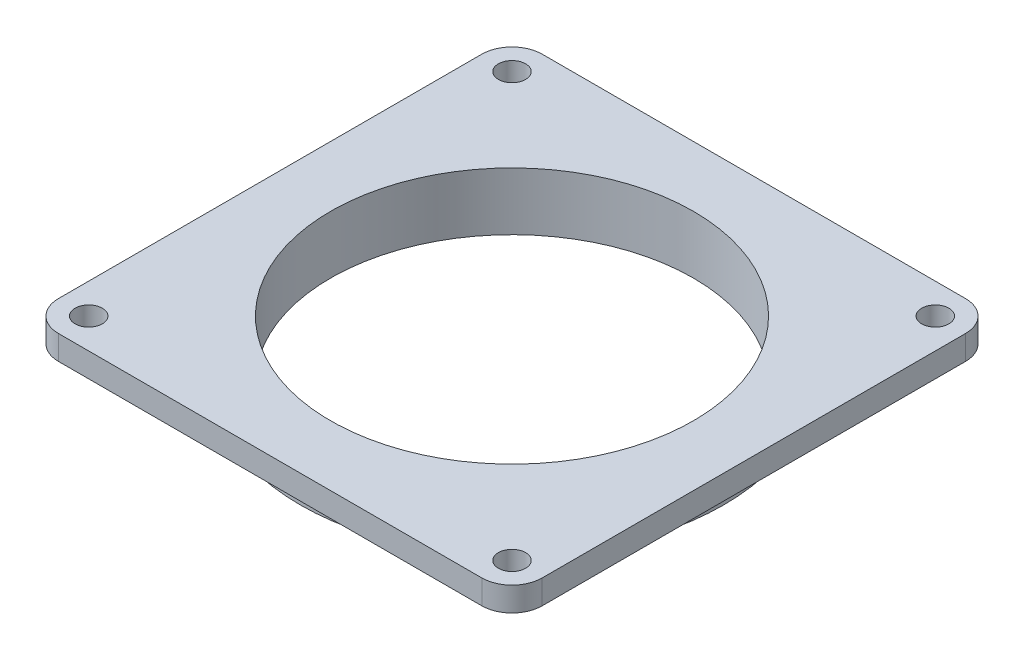
ISO-10303-21;
HEADER;
FILE_DESCRIPTION(('STEP AP214'),'2;1');
FILE_NAME('part.step','',(''),(''),'','','');
FILE_SCHEMA(('AUTOMOTIVE_DESIGN { 1 0 10303 214 1 1 1 1 }'));
ENDSEC;
DATA;
#1=APPLICATION_CONTEXT('core data for automotive mechanical design processes');
#2=APPLICATION_PROTOCOL_DEFINITION('international standard','automotive_design',2000,#1);
#3=PRODUCT_CONTEXT('',#1,'mechanical');
#4=PRODUCT('Part','Part','',(#3));
#5=PRODUCT_RELATED_PRODUCT_CATEGORY('part','',(#4));
#6=PRODUCT_DEFINITION_FORMATION('','',#4);
#7=PRODUCT_DEFINITION_CONTEXT('part definition',#1,'design');
#8=PRODUCT_DEFINITION('design','',#6,#7);
#9=PRODUCT_DEFINITION_SHAPE('','',#8);
#10=(LENGTH_UNIT() NAMED_UNIT(*) SI_UNIT(.MILLI.,.METRE.));
#11=(NAMED_UNIT(*) PLANE_ANGLE_UNIT() SI_UNIT($,.RADIAN.));
#12=(NAMED_UNIT(*) SI_UNIT($,.STERADIAN.) SOLID_ANGLE_UNIT());
#13=UNCERTAINTY_MEASURE_WITH_UNIT(LENGTH_MEASURE(1.E-05),#10,'distance_accuracy_value','');
#14=(GEOMETRIC_REPRESENTATION_CONTEXT(3) GLOBAL_UNCERTAINTY_ASSIGNED_CONTEXT((#13)) GLOBAL_UNIT_ASSIGNED_CONTEXT((#10,
#11,#12)) REPRESENTATION_CONTEXT('',''));
#15=CARTESIAN_POINT('',(0.,0.,0.));
#16=DIRECTION('',(0.,0.,1.));
#17=DIRECTION('',(1.,0.,0.));
#18=AXIS2_PLACEMENT_3D('',#15,#16,#17);
#19=CARTESIAN_POINT('',(0.,0.,0.));
#20=DIRECTION('',(0.,1.,0.));
#21=DIRECTION('',(0.,0.,1.));
#22=AXIS2_PLACEMENT_3D('',#19,#20,#21);
#23=PLANE('',#22);
#24=CARTESIAN_POINT('',(0.,0.,0.));
#25=DIRECTION('',(0.,1.,0.));
#26=DIRECTION('',(0.,0.,1.));
#27=AXIS2_PLACEMENT_3D('',#24,#25,#26);
#28=CIRCLE('',#27,35.);
#29=CARTESIAN_POINT('',(0.,0.,-35.));
#30=VERTEX_POINT('',#29);
#31=EDGE_CURVE('E155',#30,#30,#28,.T.);
#32=ORIENTED_EDGE('',*,*,#31,.F.);
#33=EDGE_LOOP('',(#32));
#34=FACE_BOUND('',#33,.T.);
#35=CARTESIAN_POINT('',(0.,0.,0.));
#36=DIRECTION('',(0.,1.,0.));
#37=DIRECTION('',(0.,0.,1.));
#38=AXIS2_PLACEMENT_3D('',#35,#36,#37);
#39=CIRCLE('',#38,30.);
#40=CARTESIAN_POINT('',(0.,0.,-30.));
#41=VERTEX_POINT('',#40);
#42=EDGE_CURVE('E151',#41,#41,#39,.T.);
#43=ORIENTED_EDGE('',*,*,#42,.T.);
#44=EDGE_LOOP('',(#43));
#45=FACE_BOUND('',#44,.T.);
#46=ADVANCED_FACE('F46',(#34,#45),#23,.F.);
#47=CARTESIAN_POINT('',(0.,5.5626,0.));
#48=DIRECTION('',(0.,-1.,0.));
#49=DIRECTION('',(0.,0.,-1.));
#50=AXIS2_PLACEMENT_3D('',#47,#48,#49);
#51=CYLINDRICAL_SURFACE('',#50,35.);
#52=CARTESIAN_POINT('',(0.,5.5626,0.));
#53=DIRECTION('',(0.,1.,0.));
#54=DIRECTION('',(0.,0.,1.));
#55=AXIS2_PLACEMENT_3D('',#52,#53,#54);
#56=CIRCLE('',#55,35.);
#57=CARTESIAN_POINT('',(0.,5.5626,-35.));
#58=VERTEX_POINT('',#57);
#59=EDGE_CURVE('E157',#58,#58,#56,.T.);
#60=CARTESIAN_POINT('',(0.,5.5626,-35.));
#61=CARTESIAN_POINT('',(0.,5.50465625,-35.));
#62=CARTESIAN_POINT('',(0.,5.4467125,-35.));
#63=CARTESIAN_POINT('',(0.,5.330825,-35.));
#64=CARTESIAN_POINT('',(0.,5.27288125,-35.));
#65=CARTESIAN_POINT('',(0.,5.15699375,-35.));
#66=CARTESIAN_POINT('',(0.,5.09905,-35.));
#67=CARTESIAN_POINT('',(0.,4.9831625,-35.));
#68=CARTESIAN_POINT('',(0.,4.92521875,-35.));
#69=CARTESIAN_POINT('',(0.,4.80933125,-35.));
#70=CARTESIAN_POINT('',(0.,4.7513875,-35.));
#71=CARTESIAN_POINT('',(0.,4.6355,-35.));
#72=CARTESIAN_POINT('',(0.,4.57755625,-35.));
#73=CARTESIAN_POINT('',(0.,4.46166875,-35.));
#74=CARTESIAN_POINT('',(0.,4.403725,-35.));
#75=CARTESIAN_POINT('',(0.,4.2878375,-35.));
#76=CARTESIAN_POINT('',(0.,4.22989375,-35.));
#77=CARTESIAN_POINT('',(0.,4.11400625,-35.));
#78=CARTESIAN_POINT('',(0.,4.0560625,-35.));
#79=CARTESIAN_POINT('',(0.,3.940175,-35.));
#80=CARTESIAN_POINT('',(0.,3.88223125,-35.));
#81=CARTESIAN_POINT('',(0.,3.76634375,-35.));
#82=CARTESIAN_POINT('',(0.,3.7084,-35.));
#83=CARTESIAN_POINT('',(0.,3.5925125,-35.));
#84=CARTESIAN_POINT('',(0.,3.53456875,-35.));
#85=CARTESIAN_POINT('',(0.,3.41868125,-35.));
#86=CARTESIAN_POINT('',(0.,3.3607375,-35.));
#87=CARTESIAN_POINT('',(0.,3.24485,-35.));
#88=CARTESIAN_POINT('',(0.,3.18690625,-35.));
#89=CARTESIAN_POINT('',(0.,3.07101875,-35.));
#90=CARTESIAN_POINT('',(0.,3.013075,-35.));
#91=CARTESIAN_POINT('',(0.,2.8971875,-35.));
#92=CARTESIAN_POINT('',(0.,2.83924375,-35.));
#93=CARTESIAN_POINT('',(0.,2.72335625,-35.));
#94=CARTESIAN_POINT('',(0.,2.6654125,-35.));
#95=CARTESIAN_POINT('',(0.,2.549525,-35.));
#96=CARTESIAN_POINT('',(0.,2.49158125,-35.));
#97=CARTESIAN_POINT('',(0.,2.37569375,-35.));
#98=CARTESIAN_POINT('',(0.,2.31775,-35.));
#99=CARTESIAN_POINT('',(0.,2.2018625,-35.));
#100=CARTESIAN_POINT('',(0.,2.14391875,-35.));
#101=CARTESIAN_POINT('',(0.,2.02803125,-35.));
#102=CARTESIAN_POINT('',(0.,1.9700875,-35.));
#103=CARTESIAN_POINT('',(0.,1.8542,-35.));
#104=CARTESIAN_POINT('',(0.,1.79625625,-35.));
#105=CARTESIAN_POINT('',(0.,1.68036875,-35.));
#106=CARTESIAN_POINT('',(0.,1.622425,-35.));
#107=CARTESIAN_POINT('',(0.,1.5065375,-35.));
#108=CARTESIAN_POINT('',(0.,1.44859375,-35.));
#109=CARTESIAN_POINT('',(0.,1.33270625,-35.));
#110=CARTESIAN_POINT('',(0.,1.2747625,-35.));
#111=CARTESIAN_POINT('',(0.,1.158875,-35.));
#112=CARTESIAN_POINT('',(0.,1.10093125,-35.));
#113=CARTESIAN_POINT('',(0.,0.98504375,-35.));
#114=CARTESIAN_POINT('',(0.,0.9271,-35.));
#115=CARTESIAN_POINT('',(0.,0.8112125,-35.));
#116=CARTESIAN_POINT('',(0.,0.75326875,-35.));
#117=CARTESIAN_POINT('',(0.,0.63738125,-35.));
#118=CARTESIAN_POINT('',(0.,0.5794375,-35.));
#119=CARTESIAN_POINT('',(0.,0.46355,-35.));
#120=CARTESIAN_POINT('',(0.,0.40560625,-35.));
#121=CARTESIAN_POINT('',(0.,0.28971875,-35.));
#122=CARTESIAN_POINT('',(0.,0.231775,-35.));
#123=CARTESIAN_POINT('',(0.,0.1158875,-35.));
#124=CARTESIAN_POINT('',(0.,0.05794375,-35.));
#125=CARTESIAN_POINT('',(0.,0.,-35.));
#126=B_SPLINE_CURVE_WITH_KNOTS('',3,(#60,#61,#62,#63,#64,#65,#66,#67,#68,#69,#70,#71,#72,#73,
#74,#75,#76,#77,#78,#79,#80,#81,#82,#83,#84,#85,#86,#87,#88,#89,#90,#91,#92,#93,#94,#95,#96,#97,
#98,#99,#100,#101,#102,#103,#104,#105,#106,#107,#108,#109,#110,#111,#112,#113,#114,#115,#116,
#117,#118,#119,#120,#121,#122,#123,#124,#125),.UNSPECIFIED.,.F.,.F.,(4,2,2,2,2,2,2,2,2,2,2,2,2,
2,2,2,2,2,2,2,2,2,2,2,2,2,2,2,2,2,2,2,4),(0.,0.173831249999999,0.347662499999999,
0.521493749999999,0.695324999999999,0.869156249999999,1.0429875,1.21681875,1.39065,1.56448125,
1.7383125,1.91214375,2.085975,2.25980625,2.4336375,2.60746875,2.7813,2.95513125,3.1289625,
3.30279375,3.476625,3.65045625,3.8242875,3.99811875,4.17195,4.34578125,4.5196125,4.69344375,
4.867275,5.04110625,5.2149375,5.38876875,5.5626),.UNSPECIFIED.);
#127=EDGE_CURVE('BSEAM266',#58,#30,#126,.T.);
#128=ORIENTED_EDGE('',*,*,#59,.F.);
#129=ORIENTED_EDGE('',*,*,#31,.T.);
#130=ORIENTED_EDGE('',*,*,#127,.T.);
#131=ORIENTED_EDGE('',*,*,#127,.F.);
#132=EDGE_LOOP('',(#128,#130,#129,#131));
#133=FACE_BOUND('',#132,.T.);
#134=ADVANCED_FACE('F266',(#133),#51,.T.);
#135=CARTESIAN_POINT('',(0.,5.5626,0.));
#136=DIRECTION('',(0.,-1.,0.));
#137=DIRECTION('',(0.,0.,-1.));
#138=AXIS2_PLACEMENT_3D('',#135,#136,#137);
#139=CYLINDRICAL_SURFACE('',#138,30.);
#140=CARTESIAN_POINT('',(0.,9.5626,0.));
#141=DIRECTION('',(0.,1.,0.));
#142=DIRECTION('',(0.,0.,1.));
#143=AXIS2_PLACEMENT_3D('',#140,#141,#142);
#144=CIRCLE('',#143,30.);
#145=CARTESIAN_POINT('',(0.,9.5626,-30.));
#146=VERTEX_POINT('',#145);
#147=EDGE_CURVE('E222',#146,#146,#144,.F.);
#148=CARTESIAN_POINT('',(0.,0.,-30.));
#149=CARTESIAN_POINT('',(0.,0.0996104166666667,-30.));
#150=CARTESIAN_POINT('',(0.,0.199220833333333,-30.));
#151=CARTESIAN_POINT('',(0.,0.398441666666667,-30.));
#152=CARTESIAN_POINT('',(0.,0.498052083333334,-30.));
#153=CARTESIAN_POINT('',(0.,0.697272916666667,-30.));
#154=CARTESIAN_POINT('',(0.,0.796883333333334,-30.));
#155=CARTESIAN_POINT('',(0.,0.996104166666667,-30.));
#156=CARTESIAN_POINT('',(0.,1.09571458333333,-30.));
#157=CARTESIAN_POINT('',(0.,1.29493541666667,-30.));
#158=CARTESIAN_POINT('',(0.,1.39454583333333,-30.));
#159=CARTESIAN_POINT('',(0.,1.59376666666667,-30.));
#160=CARTESIAN_POINT('',(0.,1.69337708333333,-30.));
#161=CARTESIAN_POINT('',(0.,1.89259791666667,-30.));
#162=CARTESIAN_POINT('',(0.,1.99220833333333,-30.));
#163=CARTESIAN_POINT('',(0.,2.19142916666667,-30.));
#164=CARTESIAN_POINT('',(0.,2.29103958333333,-30.));
#165=CARTESIAN_POINT('',(0.,2.49026041666667,-30.));
#166=CARTESIAN_POINT('',(0.,2.58987083333333,-30.));
#167=CARTESIAN_POINT('',(0.,2.78909166666667,-30.));
#168=CARTESIAN_POINT('',(0.,2.88870208333333,-30.));
#169=CARTESIAN_POINT('',(0.,3.08792291666667,-30.));
#170=CARTESIAN_POINT('',(0.,3.18753333333333,-30.));
#171=CARTESIAN_POINT('',(0.,3.38675416666667,-30.));
#172=CARTESIAN_POINT('',(0.,3.48636458333333,-30.));
#173=CARTESIAN_POINT('',(0.,3.68558541666667,-30.));
#174=CARTESIAN_POINT('',(0.,3.78519583333333,-30.));
#175=CARTESIAN_POINT('',(0.,3.98441666666667,-30.));
#176=CARTESIAN_POINT('',(0.,4.08402708333333,-30.));
#177=CARTESIAN_POINT('',(0.,4.28324791666667,-30.));
#178=CARTESIAN_POINT('',(0.,4.38285833333333,-30.));
#179=CARTESIAN_POINT('',(0.,4.58207916666667,-30.));
#180=CARTESIAN_POINT('',(0.,4.68168958333333,-30.));
#181=CARTESIAN_POINT('',(0.,4.88091041666667,-30.));
#182=CARTESIAN_POINT('',(0.,4.98052083333333,-30.));
#183=CARTESIAN_POINT('',(0.,5.17974166666667,-30.));
#184=CARTESIAN_POINT('',(0.,5.27935208333333,-30.));
#185=CARTESIAN_POINT('',(0.,5.47857291666667,-30.));
#186=CARTESIAN_POINT('',(0.,5.57818333333333,-30.));
#187=CARTESIAN_POINT('',(0.,5.77740416666667,-30.));
#188=CARTESIAN_POINT('',(0.,5.87701458333333,-30.));
#189=CARTESIAN_POINT('',(0.,6.07623541666667,-30.));
#190=CARTESIAN_POINT('',(0.,6.17584583333333,-30.));
#191=CARTESIAN_POINT('',(0.,6.37506666666667,-30.));
#192=CARTESIAN_POINT('',(0.,6.47467708333333,-30.));
#193=CARTESIAN_POINT('',(0.,6.67389791666667,-30.));
#194=CARTESIAN_POINT('',(0.,6.77350833333333,-30.));
#195=CARTESIAN_POINT('',(0.,6.97272916666667,-30.));
#196=CARTESIAN_POINT('',(0.,7.07233958333333,-30.));
#197=CARTESIAN_POINT('',(0.,7.27156041666667,-30.));
#198=CARTESIAN_POINT('',(0.,7.37117083333333,-30.));
#199=CARTESIAN_POINT('',(0.,7.57039166666667,-30.));
#200=CARTESIAN_POINT('',(0.,7.67000208333333,-30.));
#201=CARTESIAN_POINT('',(0.,7.86922291666667,-30.));
#202=CARTESIAN_POINT('',(0.,7.96883333333333,-30.));
#203=CARTESIAN_POINT('',(0.,8.16805416666667,-30.));
#204=CARTESIAN_POINT('',(0.,8.26766458333333,-30.));
#205=CARTESIAN_POINT('',(0.,8.46688541666667,-30.));
#206=CARTESIAN_POINT('',(0.,8.56649583333333,-30.));
#207=CARTESIAN_POINT('',(0.,8.76571666666667,-30.));
#208=CARTESIAN_POINT('',(0.,8.86532708333333,-30.));
#209=CARTESIAN_POINT('',(0.,9.06454791666667,-30.));
#210=CARTESIAN_POINT('',(0.,9.16415833333333,-30.));
#211=CARTESIAN_POINT('',(0.,9.36337916666667,-30.));
#212=CARTESIAN_POINT('',(0.,9.46298958333333,-30.));
#213=CARTESIAN_POINT('',(0.,9.5626,-30.));
#214=B_SPLINE_CURVE_WITH_KNOTS('',3,(#148,#149,#150,#151,#152,#153,#154,#155,#156,#157,#158,
#159,#160,#161,#162,#163,#164,#165,#166,#167,#168,#169,#170,#171,#172,#173,#174,#175,#176,#177,
#178,#179,#180,#181,#182,#183,#184,#185,#186,#187,#188,#189,#190,#191,#192,#193,#194,#195,#196,
#197,#198,#199,#200,#201,#202,#203,#204,#205,#206,#207,#208,#209,#210,#211,#212,#213),
.UNSPECIFIED.,.F.,.F.,(4,2,2,2,2,2,2,2,2,2,2,2,2,2,2,2,2,2,2,2,2,2,2,2,2,2,2,2,2,2,2,2,4),(0.,
0.29883125,0.5976625,0.89649375,1.195325,1.49415625,1.7929875,2.09181875,2.39065,2.68948125,
2.9883125,3.28714375,3.585975,3.88480625,4.1836375,4.48246875,4.7813,5.08013125,5.3789625,
5.67779375,5.976625,6.27545625,6.5742875,6.87311875,7.17195,7.47078125,7.7696125,8.06844375,
8.367275,8.66610625,8.9649375,9.26376875,9.5626),.UNSPECIFIED.);
#215=EDGE_CURVE('BSEAM272',#41,#146,#214,.T.);
#216=ORIENTED_EDGE('',*,*,#42,.F.);
#217=ORIENTED_EDGE('',*,*,#147,.F.);
#218=ORIENTED_EDGE('',*,*,#215,.T.);
#219=ORIENTED_EDGE('',*,*,#215,.F.);
#220=EDGE_LOOP('',(#216,#218,#217,#219));
#221=FACE_BOUND('',#220,.T.);
#222=ADVANCED_FACE('F272',(#221),#139,.F.);
#223=CARTESIAN_POINT('',(-40.,9.5626,0.));
#224=DIRECTION('',(-1.,0.,0.));
#225=DIRECTION('',(0.,0.,1.));
#226=AXIS2_PLACEMENT_3D('',#223,#224,#225);
#227=PLANE('',#226);
#228=DIRECTION('',(0.,0.,-1.));
#229=VECTOR('',#228,1.);
#230=CARTESIAN_POINT('',(-40.,5.5626,0.));
#231=LINE('',#230,#229);
#232=CARTESIAN_POINT('',(-40.,5.5626,35.));
#233=VERTEX_POINT('',#232);
#234=CARTESIAN_POINT('',(-40.,5.5626,-35.));
#235=VERTEX_POINT('',#234);
#236=EDGE_CURVE('E147',#233,#235,#231,.T.);
#237=ORIENTED_EDGE('',*,*,#236,.F.);
#238=DIRECTION('',(0.,-1.,0.));
#239=VECTOR('',#238,1.);
#240=CARTESIAN_POINT('',(-40.,9.5626,35.));
#241=LINE('',#240,#239);
#242=CARTESIAN_POINT('',(-40.,9.5626,35.));
#243=VERTEX_POINT('',#242);
#244=EDGE_CURVE('E193',#233,#243,#241,.F.);
#245=ORIENTED_EDGE('',*,*,#244,.T.);
#246=DIRECTION('',(0.,0.,-1.));
#247=VECTOR('',#246,1.);
#248=CARTESIAN_POINT('',(-40.,9.5626,0.));
#249=LINE('',#248,#247);
#250=CARTESIAN_POINT('',(-40.,9.5626,-35.));
#251=VERTEX_POINT('',#250);
#252=EDGE_CURVE('E211',#243,#251,#249,.T.);
#253=ORIENTED_EDGE('',*,*,#252,.T.);
#254=DIRECTION('',(0.,-1.,0.));
#255=VECTOR('',#254,1.);
#256=CARTESIAN_POINT('',(-40.,5.5626,-35.));
#257=LINE('',#256,#255);
#258=EDGE_CURVE('E189',#251,#235,#257,.T.);
#259=ORIENTED_EDGE('',*,*,#258,.T.);
#260=EDGE_LOOP('',(#237,#245,#253,#259));
#261=FACE_BOUND('',#260,.T.);
#262=ADVANCED_FACE('F208',(#261),#227,.T.);
#263=CARTESIAN_POINT('',(0.,9.5626,40.));
#264=DIRECTION('',(0.,0.,1.));
#265=DIRECTION('',(1.,0.,0.));
#266=AXIS2_PLACEMENT_3D('',#263,#264,#265);
#267=PLANE('',#266);
#268=DIRECTION('',(-1.,0.,0.));
#269=VECTOR('',#268,1.);
#270=CARTESIAN_POINT('',(0.,5.5626,40.));
#271=LINE('',#270,#269);
#272=CARTESIAN_POINT('',(35.,5.5626,40.));
#273=VERTEX_POINT('',#272);
#274=CARTESIAN_POINT('',(-35.,5.5626,40.));
#275=VERTEX_POINT('',#274);
#276=EDGE_CURVE('E141',#273,#275,#271,.T.);
#277=ORIENTED_EDGE('',*,*,#276,.F.);
#278=DIRECTION('',(0.,-1.,0.));
#279=VECTOR('',#278,1.);
#280=CARTESIAN_POINT('',(35.,9.5626,40.));
#281=LINE('',#280,#279);
#282=CARTESIAN_POINT('',(35.,9.5626,40.));
#283=VERTEX_POINT('',#282);
#284=EDGE_CURVE('E117',#273,#283,#281,.F.);
#285=ORIENTED_EDGE('',*,*,#284,.T.);
#286=DIRECTION('',(-1.,0.,0.));
#287=VECTOR('',#286,1.);
#288=CARTESIAN_POINT('',(0.,9.5626,40.));
#289=LINE('',#288,#287);
#290=CARTESIAN_POINT('',(-35.,9.5626,40.));
#291=VERTEX_POINT('',#290);
#292=EDGE_CURVE('E214',#283,#291,#289,.T.);
#293=ORIENTED_EDGE('',*,*,#292,.T.);
#294=DIRECTION('',(0.,-1.,0.));
#295=VECTOR('',#294,1.);
#296=CARTESIAN_POINT('',(-35.,9.5626,40.));
#297=LINE('',#296,#295);
#298=EDGE_CURVE('E123',#291,#275,#297,.T.);
#299=ORIENTED_EDGE('',*,*,#298,.T.);
#300=EDGE_LOOP('',(#277,#285,#293,#299));
#301=FACE_BOUND('',#300,.T.);
#302=ADVANCED_FACE('F262',(#301),#267,.T.);
#303=CARTESIAN_POINT('',(40.,9.5626,0.));
#304=DIRECTION('',(-1.,0.,0.));
#305=DIRECTION('',(0.,0.,1.));
#306=AXIS2_PLACEMENT_3D('',#303,#304,#305);
#307=PLANE('',#306);
#308=DIRECTION('',(0.,0.,-1.));
#309=VECTOR('',#308,1.);
#310=CARTESIAN_POINT('',(40.,9.5626,0.));
#311=LINE('',#310,#309);
#312=CARTESIAN_POINT('',(40.,9.5626,35.));
#313=VERTEX_POINT('',#312);
#314=CARTESIAN_POINT('',(40.,9.5626,-35.));
#315=VERTEX_POINT('',#314);
#316=EDGE_CURVE('E132',#313,#315,#311,.T.);
#317=ORIENTED_EDGE('',*,*,#316,.F.);
#318=DIRECTION('',(0.,-1.,0.));
#319=VECTOR('',#318,1.);
#320=CARTESIAN_POINT('',(40.,5.5626,35.));
#321=LINE('',#320,#319);
#322=CARTESIAN_POINT('',(40.,5.5626,35.));
#323=VERTEX_POINT('',#322);
#324=EDGE_CURVE('E116',#313,#323,#321,.T.);
#325=ORIENTED_EDGE('',*,*,#324,.T.);
#326=DIRECTION('',(0.,0.,-1.));
#327=VECTOR('',#326,1.);
#328=CARTESIAN_POINT('',(40.,5.5626,0.));
#329=LINE('',#328,#327);
#330=CARTESIAN_POINT('',(40.,5.5626,-35.));
#331=VERTEX_POINT('',#330);
#332=EDGE_CURVE('E130',#323,#331,#329,.T.);
#333=ORIENTED_EDGE('',*,*,#332,.T.);
#334=DIRECTION('',(0.,-1.,0.));
#335=VECTOR('',#334,1.);
#336=CARTESIAN_POINT('',(40.,9.5626,-35.));
#337=LINE('',#336,#335);
#338=EDGE_CURVE('E135',#331,#315,#337,.F.);
#339=ORIENTED_EDGE('',*,*,#338,.T.);
#340=EDGE_LOOP('',(#317,#325,#333,#339));
#341=FACE_BOUND('',#340,.T.);
#342=ADVANCED_FACE('F129',(#341),#307,.F.);
#343=CARTESIAN_POINT('',(35.,9.5626,35.));
#344=DIRECTION('',(0.,-1.,0.));
#345=DIRECTION('',(0.,0.,-1.));
#346=AXIS2_PLACEMENT_3D('',#343,#344,#345);
#347=CYLINDRICAL_SURFACE('',#346,2.25);
#348=CARTESIAN_POINT('',(35.,9.5626,35.));
#349=DIRECTION('',(0.,1.,0.));
#350=DIRECTION('',(0.,0.,1.));
#351=AXIS2_PLACEMENT_3D('',#348,#349,#350);
#352=CIRCLE('',#351,2.25);
#353=CARTESIAN_POINT('',(35.,9.5626,37.25));
#354=VERTEX_POINT('',#353);
#355=EDGE_CURVE('E215',#354,#354,#352,.T.);
#356=ORIENTED_EDGE('',*,*,#355,.T.);
#357=EDGE_LOOP('',(#356));
#358=FACE_BOUND('',#357,.T.);
#359=CARTESIAN_POINT('',(35.,5.5626,35.));
#360=DIRECTION('',(0.,1.,0.));
#361=DIRECTION('',(0.,0.,1.));
#362=AXIS2_PLACEMENT_3D('',#359,#360,#361);
#363=CIRCLE('',#362,2.25);
#364=CARTESIAN_POINT('',(35.,5.5626,37.25));
#365=VERTEX_POINT('',#364);
#366=EDGE_CURVE('E242',#365,#365,#363,.T.);
#367=ORIENTED_EDGE('',*,*,#366,.F.);
#368=EDGE_LOOP('',(#367));
#369=FACE_BOUND('',#368,.T.);
#370=ADVANCED_FACE('F249',(#358,#369),#347,.F.);
#371=CARTESIAN_POINT('',(35.,9.5626,-35.));
#372=DIRECTION('',(0.,-1.,0.));
#373=DIRECTION('',(0.,0.,-1.));
#374=AXIS2_PLACEMENT_3D('',#371,#372,#373);
#375=CYLINDRICAL_SURFACE('',#374,2.25);
#376=CARTESIAN_POINT('',(35.,9.5626,-35.));
#377=DIRECTION('',(0.,1.,0.));
#378=DIRECTION('',(0.,0.,1.));
#379=AXIS2_PLACEMENT_3D('',#376,#377,#378);
#380=CIRCLE('',#379,2.25);
#381=CARTESIAN_POINT('',(35.,9.5626,-32.75));
#382=VERTEX_POINT('',#381);
#383=EDGE_CURVE('E321',#382,#382,#380,.T.);
#384=ORIENTED_EDGE('',*,*,#383,.T.);
#385=EDGE_LOOP('',(#384));
#386=FACE_BOUND('',#385,.T.);
#387=CARTESIAN_POINT('',(35.,5.5626,-35.));
#388=DIRECTION('',(0.,1.,0.));
#389=DIRECTION('',(0.,0.,1.));
#390=AXIS2_PLACEMENT_3D('',#387,#388,#389);
#391=CIRCLE('',#390,2.25);
#392=CARTESIAN_POINT('',(35.,5.5626,-32.75));
#393=VERTEX_POINT('',#392);
#394=EDGE_CURVE('E238',#393,#393,#391,.T.);
#395=ORIENTED_EDGE('',*,*,#394,.F.);
#396=EDGE_LOOP('',(#395));
#397=FACE_BOUND('',#396,.T.);
#398=ADVANCED_FACE('F251',(#386,#397),#375,.F.);
#399=CARTESIAN_POINT('',(-35.,9.5626,-35.));
#400=DIRECTION('',(0.,-1.,0.));
#401=DIRECTION('',(0.,0.,-1.));
#402=AXIS2_PLACEMENT_3D('',#399,#400,#401);
#403=CYLINDRICAL_SURFACE('',#402,2.25);
#404=CARTESIAN_POINT('',(-35.,9.5626,-35.));
#405=DIRECTION('',(0.,1.,0.));
#406=DIRECTION('',(0.,0.,1.));
#407=AXIS2_PLACEMENT_3D('',#404,#405,#406);
#408=CIRCLE('',#407,2.25);
#409=CARTESIAN_POINT('',(-35.,9.5626,-32.75));
#410=VERTEX_POINT('',#409);
#411=EDGE_CURVE('E317',#410,#410,#408,.T.);
#412=ORIENTED_EDGE('',*,*,#411,.T.);
#413=EDGE_LOOP('',(#412));
#414=FACE_BOUND('',#413,.T.);
#415=CARTESIAN_POINT('',(-35.,5.5626,-35.));
#416=DIRECTION('',(0.,1.,0.));
#417=DIRECTION('',(0.,0.,1.));
#418=AXIS2_PLACEMENT_3D('',#415,#416,#417);
#419=CIRCLE('',#418,2.25);
#420=CARTESIAN_POINT('',(-35.,5.5626,-32.75));
#421=VERTEX_POINT('',#420);
#422=EDGE_CURVE('E234',#421,#421,#419,.T.);
#423=ORIENTED_EDGE('',*,*,#422,.F.);
#424=EDGE_LOOP('',(#423));
#425=FACE_BOUND('',#424,.T.);
#426=ADVANCED_FACE('F258',(#414,#425),#403,.F.);
#427=CARTESIAN_POINT('',(-35.,9.5626,35.));
#428=DIRECTION('',(0.,-1.,0.));
#429=DIRECTION('',(0.,0.,-1.));
#430=AXIS2_PLACEMENT_3D('',#427,#428,#429);
#431=CYLINDRICAL_SURFACE('',#430,2.25);
#432=CARTESIAN_POINT('',(-35.,9.5626,35.));
#433=DIRECTION('',(0.,1.,0.));
#434=DIRECTION('',(0.,0.,1.));
#435=AXIS2_PLACEMENT_3D('',#432,#433,#434);
#436=CIRCLE('',#435,2.25);
#437=CARTESIAN_POINT('',(-35.,9.5626,37.25));
#438=VERTEX_POINT('',#437);
#439=EDGE_CURVE('E145',#438,#438,#436,.T.);
#440=ORIENTED_EDGE('',*,*,#439,.T.);
#441=EDGE_LOOP('',(#440));
#442=FACE_BOUND('',#441,.T.);
#443=CARTESIAN_POINT('',(-35.,5.5626,35.));
#444=DIRECTION('',(0.,1.,0.));
#445=DIRECTION('',(0.,0.,1.));
#446=AXIS2_PLACEMENT_3D('',#443,#444,#445);
#447=CIRCLE('',#446,2.25);
#448=CARTESIAN_POINT('',(-35.,5.5626,37.25));
#449=VERTEX_POINT('',#448);
#450=EDGE_CURVE('E230',#449,#449,#447,.T.);
#451=ORIENTED_EDGE('',*,*,#450,.F.);
#452=EDGE_LOOP('',(#451));
#453=FACE_BOUND('',#452,.T.);
#454=ADVANCED_FACE('F303',(#442,#453),#431,.F.);
#455=CARTESIAN_POINT('',(0.,9.5626,-40.));
#456=DIRECTION('',(0.,0.,1.));
#457=DIRECTION('',(1.,0.,0.));
#458=AXIS2_PLACEMENT_3D('',#455,#456,#457);
#459=PLANE('',#458);
#460=DIRECTION('',(-1.,0.,0.));
#461=VECTOR('',#460,1.);
#462=CARTESIAN_POINT('',(0.,5.5626,-40.));
#463=LINE('',#462,#461);
#464=CARTESIAN_POINT('',(35.,5.5626,-40.));
#465=VERTEX_POINT('',#464);
#466=CARTESIAN_POINT('',(-35.,5.5626,-40.));
#467=VERTEX_POINT('',#466);
#468=EDGE_CURVE('E140',#465,#467,#463,.T.);
#469=ORIENTED_EDGE('',*,*,#468,.T.);
#470=DIRECTION('',(0.,-1.,0.));
#471=VECTOR('',#470,1.);
#472=CARTESIAN_POINT('',(-35.,9.5626,-40.));
#473=LINE('',#472,#471);
#474=CARTESIAN_POINT('',(-35.,9.5626,-40.));
#475=VERTEX_POINT('',#474);
#476=EDGE_CURVE('E11',#467,#475,#473,.F.);
#477=ORIENTED_EDGE('',*,*,#476,.T.);
#478=DIRECTION('',(-1.,0.,0.));
#479=VECTOR('',#478,1.);
#480=CARTESIAN_POINT('',(0.,9.5626,-40.));
#481=LINE('',#480,#479);
#482=CARTESIAN_POINT('',(35.,9.5626,-40.));
#483=VERTEX_POINT('',#482);
#484=EDGE_CURVE('E156',#483,#475,#481,.T.);
#485=ORIENTED_EDGE('',*,*,#484,.F.);
#486=DIRECTION('',(0.,-1.,0.));
#487=VECTOR('',#486,1.);
#488=CARTESIAN_POINT('',(35.,9.5626,-40.));
#489=LINE('',#488,#487);
#490=EDGE_CURVE('E55',#483,#465,#489,.T.);
#491=ORIENTED_EDGE('',*,*,#490,.T.);
#492=EDGE_LOOP('',(#469,#477,#485,#491));
#493=FACE_BOUND('',#492,.T.);
#494=ADVANCED_FACE('F198',(#493),#459,.F.);
#495=CARTESIAN_POINT('',(0.,9.5626,0.));
#496=DIRECTION('',(0.,1.,0.));
#497=DIRECTION('',(0.,0.,1.));
#498=AXIS2_PLACEMENT_3D('',#495,#496,#497);
#499=PLANE('',#498);
#500=ORIENTED_EDGE('',*,*,#439,.F.);
#501=EDGE_LOOP('',(#500));
#502=FACE_BOUND('',#501,.T.);
#503=ORIENTED_EDGE('',*,*,#411,.F.);
#504=EDGE_LOOP('',(#503));
#505=FACE_BOUND('',#504,.T.);
#506=ORIENTED_EDGE('',*,*,#383,.F.);
#507=EDGE_LOOP('',(#506));
#508=FACE_BOUND('',#507,.T.);
#509=ORIENTED_EDGE('',*,*,#147,.T.);
#510=EDGE_LOOP('',(#509));
#511=FACE_BOUND('',#510,.T.);
#512=ORIENTED_EDGE('',*,*,#355,.F.);
#513=EDGE_LOOP('',(#512));
#514=FACE_BOUND('',#513,.T.);
#515=ORIENTED_EDGE('',*,*,#292,.F.);
#516=CARTESIAN_POINT('',(35.,9.5626,35.));
#517=DIRECTION('',(0.,1.,0.));
#518=DIRECTION('',(0.,0.,1.));
#519=AXIS2_PLACEMENT_3D('',#516,#517,#518);
#520=CIRCLE('',#519,5.);
#521=EDGE_CURVE('E186',#283,#313,#520,.T.);
#522=ORIENTED_EDGE('',*,*,#521,.T.);
#523=ORIENTED_EDGE('',*,*,#316,.T.);
#524=CARTESIAN_POINT('',(35.,9.5626,-35.));
#525=DIRECTION('',(0.,1.,0.));
#526=DIRECTION('',(0.,0.,1.));
#527=AXIS2_PLACEMENT_3D('',#524,#525,#526);
#528=CIRCLE('',#527,5.);
#529=EDGE_CURVE('E67',#315,#483,#528,.T.);
#530=ORIENTED_EDGE('',*,*,#529,.T.);
#531=ORIENTED_EDGE('',*,*,#484,.T.);
#532=CARTESIAN_POINT('',(-35.,9.5626,-35.));
#533=DIRECTION('',(0.,1.,0.));
#534=DIRECTION('',(0.,0.,1.));
#535=AXIS2_PLACEMENT_3D('',#532,#533,#534);
#536=CIRCLE('',#535,5.);
#537=EDGE_CURVE('E180',#475,#251,#536,.T.);
#538=ORIENTED_EDGE('',*,*,#537,.T.);
#539=ORIENTED_EDGE('',*,*,#252,.F.);
#540=CARTESIAN_POINT('',(-35.,9.5626,35.));
#541=DIRECTION('',(0.,1.,0.));
#542=DIRECTION('',(0.,0.,1.));
#543=AXIS2_PLACEMENT_3D('',#540,#541,#542);
#544=CIRCLE('',#543,5.);
#545=EDGE_CURVE('E183',#243,#291,#544,.T.);
#546=ORIENTED_EDGE('',*,*,#545,.T.);
#547=EDGE_LOOP('',(#515,#522,#523,#530,#531,#538,#539,#546));
#548=FACE_BOUND('',#547,.T.);
#549=ADVANCED_FACE('F292',(#502,#505,#508,#511,#514,#548),#499,.T.);
#550=CARTESIAN_POINT('',(0.,5.5626,0.));
#551=DIRECTION('',(0.,1.,0.));
#552=DIRECTION('',(0.,0.,1.));
#553=AXIS2_PLACEMENT_3D('',#550,#551,#552);
#554=PLANE('',#553);
#555=ORIENTED_EDGE('',*,*,#59,.T.);
#556=EDGE_LOOP('',(#555));
#557=FACE_BOUND('',#556,.T.);
#558=ORIENTED_EDGE('',*,*,#450,.T.);
#559=EDGE_LOOP('',(#558));
#560=FACE_BOUND('',#559,.T.);
#561=ORIENTED_EDGE('',*,*,#422,.T.);
#562=EDGE_LOOP('',(#561));
#563=FACE_BOUND('',#562,.T.);
#564=ORIENTED_EDGE('',*,*,#394,.T.);
#565=EDGE_LOOP('',(#564));
#566=FACE_BOUND('',#565,.T.);
#567=ORIENTED_EDGE('',*,*,#366,.T.);
#568=EDGE_LOOP('',(#567));
#569=FACE_BOUND('',#568,.T.);
#570=ORIENTED_EDGE('',*,*,#332,.F.);
#571=CARTESIAN_POINT('',(35.,5.5626,35.));
#572=DIRECTION('',(0.,1.,0.));
#573=DIRECTION('',(0.,0.,1.));
#574=AXIS2_PLACEMENT_3D('',#571,#572,#573);
#575=CIRCLE('',#574,5.);
#576=EDGE_CURVE('E112',#323,#273,#575,.F.);
#577=ORIENTED_EDGE('',*,*,#576,.T.);
#578=ORIENTED_EDGE('',*,*,#276,.T.);
#579=CARTESIAN_POINT('',(-35.,5.5626,35.));
#580=DIRECTION('',(0.,1.,0.));
#581=DIRECTION('',(0.,0.,1.));
#582=AXIS2_PLACEMENT_3D('',#579,#580,#581);
#583=CIRCLE('',#582,5.);
#584=EDGE_CURVE('E124',#275,#233,#583,.F.);
#585=ORIENTED_EDGE('',*,*,#584,.T.);
#586=ORIENTED_EDGE('',*,*,#236,.T.);
#587=CARTESIAN_POINT('',(-35.,5.5626,-35.));
#588=DIRECTION('',(0.,1.,0.));
#589=DIRECTION('',(0.,0.,1.));
#590=AXIS2_PLACEMENT_3D('',#587,#588,#589);
#591=CIRCLE('',#590,5.);
#592=EDGE_CURVE('E168',#235,#467,#591,.F.);
#593=ORIENTED_EDGE('',*,*,#592,.T.);
#594=ORIENTED_EDGE('',*,*,#468,.F.);
#595=CARTESIAN_POINT('',(35.,5.5626,-35.));
#596=DIRECTION('',(0.,1.,0.));
#597=DIRECTION('',(0.,0.,1.));
#598=AXIS2_PLACEMENT_3D('',#595,#596,#597);
#599=CIRCLE('',#598,5.);
#600=EDGE_CURVE('E134',#465,#331,#599,.F.);
#601=ORIENTED_EDGE('',*,*,#600,.T.);
#602=EDGE_LOOP('',(#570,#577,#578,#585,#586,#593,#594,#601));
#603=FACE_BOUND('',#602,.T.);
#604=ADVANCED_FACE('F137',(#557,#560,#563,#566,#569,#603),#554,.F.);
#605=CARTESIAN_POINT('',(35.,9.5626,35.));
#606=DIRECTION('',(0.,1.,0.));
#607=DIRECTION('',(0.,0.,1.));
#608=AXIS2_PLACEMENT_3D('',#605,#606,#607);
#609=CYLINDRICAL_SURFACE('',#608,5.);
#610=ORIENTED_EDGE('',*,*,#521,.F.);
#611=ORIENTED_EDGE('',*,*,#284,.F.);
#612=ORIENTED_EDGE('',*,*,#576,.F.);
#613=ORIENTED_EDGE('',*,*,#324,.F.);
#614=EDGE_LOOP('',(#610,#611,#612,#613));
#615=FACE_BOUND('',#614,.T.);
#616=ADVANCED_FACE('F115',(#615),#609,.T.);
#617=CARTESIAN_POINT('',(-35.,9.5626,35.));
#618=DIRECTION('',(0.,-1.,0.));
#619=DIRECTION('',(0.,0.,-1.));
#620=AXIS2_PLACEMENT_3D('',#617,#618,#619);
#621=CYLINDRICAL_SURFACE('',#620,5.);
#622=ORIENTED_EDGE('',*,*,#545,.F.);
#623=ORIENTED_EDGE('',*,*,#244,.F.);
#624=ORIENTED_EDGE('',*,*,#584,.F.);
#625=ORIENTED_EDGE('',*,*,#298,.F.);
#626=EDGE_LOOP('',(#622,#623,#624,#625));
#627=FACE_BOUND('',#626,.T.);
#628=ADVANCED_FACE('F282',(#627),#621,.T.);
#629=CARTESIAN_POINT('',(-35.,9.5626,-35.));
#630=DIRECTION('',(0.,1.,0.));
#631=DIRECTION('',(0.,0.,1.));
#632=AXIS2_PLACEMENT_3D('',#629,#630,#631);
#633=CYLINDRICAL_SURFACE('',#632,5.);
#634=ORIENTED_EDGE('',*,*,#537,.F.);
#635=ORIENTED_EDGE('',*,*,#476,.F.);
#636=ORIENTED_EDGE('',*,*,#592,.F.);
#637=ORIENTED_EDGE('',*,*,#258,.F.);
#638=EDGE_LOOP('',(#634,#635,#636,#637));
#639=FACE_BOUND('',#638,.T.);
#640=ADVANCED_FACE('F205',(#639),#633,.T.);
#641=CARTESIAN_POINT('',(35.,9.5626,-35.));
#642=DIRECTION('',(0.,-1.,0.));
#643=DIRECTION('',(0.,0.,-1.));
#644=AXIS2_PLACEMENT_3D('',#641,#642,#643);
#645=CYLINDRICAL_SURFACE('',#644,5.);
#646=ORIENTED_EDGE('',*,*,#529,.F.);
#647=ORIENTED_EDGE('',*,*,#338,.F.);
#648=ORIENTED_EDGE('',*,*,#600,.F.);
#649=ORIENTED_EDGE('',*,*,#490,.F.);
#650=EDGE_LOOP('',(#646,#647,#648,#649));
#651=FACE_BOUND('',#650,.T.);
#652=ADVANCED_FACE('F48',(#651),#645,.T.);
#653=CLOSED_SHELL('',(#46,#134,#222,#262,#302,#342,#370,#398,#426,#454,#494,#549,#604,#616,#628,
#640,#652));
#654=MANIFOLD_SOLID_BREP('B2',#653);
#655=ADVANCED_BREP_SHAPE_REPRESENTATION('',(#18,#654),#14);
#656=SHAPE_DEFINITION_REPRESENTATION(#9,#655);
ENDSEC;
END-ISO-10303-21;
